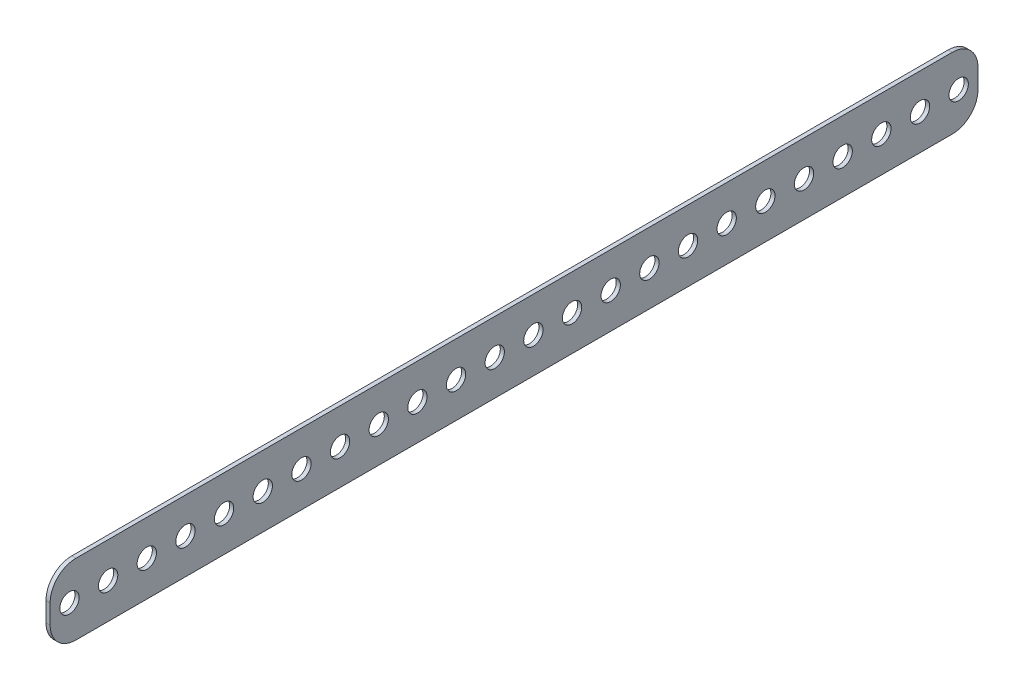
ISO-10303-21;
HEADER;
FILE_DESCRIPTION(('STEP AP214'),'2;1');
FILE_NAME('part.step','',(''),(''),'','','');
FILE_SCHEMA(('AUTOMOTIVE_DESIGN { 1 0 10303 214 1 1 1 1 }'));
ENDSEC;
DATA;
#1=APPLICATION_CONTEXT('core data for automotive mechanical design processes');
#2=APPLICATION_PROTOCOL_DEFINITION('international standard','automotive_design',2000,#1);
#3=PRODUCT_CONTEXT('',#1,'mechanical');
#4=PRODUCT('Part','Part','',(#3));
#5=PRODUCT_RELATED_PRODUCT_CATEGORY('part','',(#4));
#6=PRODUCT_DEFINITION_FORMATION('','',#4);
#7=PRODUCT_DEFINITION_CONTEXT('part definition',#1,'design');
#8=PRODUCT_DEFINITION('design','',#6,#7);
#9=PRODUCT_DEFINITION_SHAPE('','',#8);
#10=(LENGTH_UNIT() NAMED_UNIT(*) SI_UNIT(.MILLI.,.METRE.));
#11=(NAMED_UNIT(*) PLANE_ANGLE_UNIT() SI_UNIT($,.RADIAN.));
#12=(NAMED_UNIT(*) SI_UNIT($,.STERADIAN.) SOLID_ANGLE_UNIT());
#13=UNCERTAINTY_MEASURE_WITH_UNIT(LENGTH_MEASURE(1.E-05),#10,'distance_accuracy_value','');
#14=(GEOMETRIC_REPRESENTATION_CONTEXT(3) GLOBAL_UNCERTAINTY_ASSIGNED_CONTEXT((#13)) GLOBAL_UNIT_ASSIGNED_CONTEXT((#10,
#11,#12)) REPRESENTATION_CONTEXT('',''));
#15=CARTESIAN_POINT('',(0.,0.,0.));
#16=DIRECTION('',(0.,0.,1.));
#17=DIRECTION('',(1.,0.,0.));
#18=AXIS2_PLACEMENT_3D('',#15,#16,#17);
#19=CARTESIAN_POINT('',(0.,0.,228.6));
#20=DIRECTION('',(1.,0.,0.));
#21=DIRECTION('',(0.,0.,-1.));
#22=AXIS2_PLACEMENT_3D('',#19,#20,#21);
#23=PLANE('',#22);
#24=CARTESIAN_POINT('',(0.,17.4625,200.025));
#25=DIRECTION('',(-1.,0.,0.));
#26=DIRECTION('',(0.,0.,1.));
#27=AXIS2_PLACEMENT_3D('',#24,#25,#26);
#28=CIRCLE('',#27,4.76250000000001);
#29=CARTESIAN_POINT('',(0.,17.4625,204.7875));
#30=VERTEX_POINT('',#29);
#31=EDGE_CURVE('E513',#30,#30,#28,.T.);
#32=ORIENTED_EDGE('',*,*,#31,.F.);
#33=EDGE_LOOP('',(#32));
#34=FACE_BOUND('',#33,.T.);
#35=CARTESIAN_POINT('',(0.,17.4625,219.075));
#36=DIRECTION('',(-1.,0.,0.));
#37=DIRECTION('',(0.,0.,1.));
#38=AXIS2_PLACEMENT_3D('',#35,#36,#37);
#39=CIRCLE('',#38,4.76250000000001);
#40=CARTESIAN_POINT('',(0.,17.4625,223.8375));
#41=VERTEX_POINT('',#40);
#42=EDGE_CURVE('E516',#41,#41,#39,.T.);
#43=ORIENTED_EDGE('',*,*,#42,.F.);
#44=EDGE_LOOP('',(#43));
#45=FACE_BOUND('',#44,.T.);
#46=DIRECTION('',(0.,0.,-1.));
#47=VECTOR('',#46,1.);
#48=CARTESIAN_POINT('',(0.,34.925,228.6));
#49=LINE('',#48,#47);
#50=CARTESIAN_POINT('',(0.,34.925,215.9));
#51=VERTEX_POINT('',#50);
#52=CARTESIAN_POINT('',(0.,34.925,-215.9));
#53=VERTEX_POINT('',#52);
#54=EDGE_CURVE('E103',#51,#53,#49,.T.);
#55=ORIENTED_EDGE('',*,*,#54,.T.);
#56=CARTESIAN_POINT('',(0.,22.225,-215.9));
#57=DIRECTION('',(1.,0.,0.));
#58=DIRECTION('',(0.,0.,-1.));
#59=AXIS2_PLACEMENT_3D('',#56,#57,#58);
#60=CIRCLE('',#59,12.7);
#61=CARTESIAN_POINT('',(0.,22.225,-228.6));
#62=VERTEX_POINT('',#61);
#63=EDGE_CURVE('E136',#53,#62,#60,.F.);
#64=ORIENTED_EDGE('',*,*,#63,.T.);
#65=DIRECTION('',(0.,-1.,0.));
#66=VECTOR('',#65,1.);
#67=CARTESIAN_POINT('',(0.,0.,-228.6));
#68=LINE('',#67,#66);
#69=CARTESIAN_POINT('',(0.,12.7,-228.6));
#70=VERTEX_POINT('',#69);
#71=EDGE_CURVE('E159',#62,#70,#68,.T.);
#72=ORIENTED_EDGE('',*,*,#71,.T.);
#73=CARTESIAN_POINT('',(0.,12.7,-215.9));
#74=DIRECTION('',(1.,0.,0.));
#75=DIRECTION('',(0.,0.,-1.));
#76=AXIS2_PLACEMENT_3D('',#73,#74,#75);
#77=CIRCLE('',#76,12.7);
#78=CARTESIAN_POINT('',(0.,0.,-215.9));
#79=VERTEX_POINT('',#78);
#80=EDGE_CURVE('E134',#70,#79,#77,.F.);
#81=ORIENTED_EDGE('',*,*,#80,.T.);
#82=DIRECTION('',(0.,0.,-1.));
#83=VECTOR('',#82,1.);
#84=CARTESIAN_POINT('',(0.,0.,228.6));
#85=LINE('',#84,#83);
#86=CARTESIAN_POINT('',(0.,0.,215.9));
#87=VERTEX_POINT('',#86);
#88=EDGE_CURVE('E168',#87,#79,#85,.T.);
#89=ORIENTED_EDGE('',*,*,#88,.F.);
#90=CARTESIAN_POINT('',(0.,12.7,215.9));
#91=DIRECTION('',(1.,0.,0.));
#92=DIRECTION('',(0.,0.,-1.));
#93=AXIS2_PLACEMENT_3D('',#90,#91,#92);
#94=CIRCLE('',#93,12.7);
#95=CARTESIAN_POINT('',(0.,12.7,228.6));
#96=VERTEX_POINT('',#95);
#97=EDGE_CURVE('E110',#87,#96,#94,.F.);
#98=ORIENTED_EDGE('',*,*,#97,.T.);
#99=DIRECTION('',(0.,-1.,0.));
#100=VECTOR('',#99,1.);
#101=CARTESIAN_POINT('',(0.,0.,228.6));
#102=LINE('',#101,#100);
#103=CARTESIAN_POINT('',(0.,22.225,228.6));
#104=VERTEX_POINT('',#103);
#105=EDGE_CURVE('E105',#104,#96,#102,.T.);
#106=ORIENTED_EDGE('',*,*,#105,.F.);
#107=CARTESIAN_POINT('',(0.,22.225,215.9));
#108=DIRECTION('',(1.,0.,0.));
#109=DIRECTION('',(0.,0.,-1.));
#110=AXIS2_PLACEMENT_3D('',#107,#108,#109);
#111=CIRCLE('',#110,12.7);
#112=EDGE_CURVE('E100',#104,#51,#111,.F.);
#113=ORIENTED_EDGE('',*,*,#112,.T.);
#114=EDGE_LOOP('',(#55,#64,#72,#81,#89,#98,#106,#113));
#115=FACE_BOUND('',#114,.T.);
#116=CARTESIAN_POINT('',(0.,17.4625,180.975));
#117=DIRECTION('',(-1.,0.,0.));
#118=DIRECTION('',(0.,0.,1.));
#119=AXIS2_PLACEMENT_3D('',#116,#117,#118);
#120=CIRCLE('',#119,4.76250000000001);
#121=CARTESIAN_POINT('',(0.,17.4625,185.7375));
#122=VERTEX_POINT('',#121);
#123=EDGE_CURVE('E171',#122,#122,#120,.T.);
#124=ORIENTED_EDGE('',*,*,#123,.F.);
#125=EDGE_LOOP('',(#124));
#126=FACE_BOUND('',#125,.T.);
#127=CARTESIAN_POINT('',(0.,17.4625,161.925));
#128=DIRECTION('',(-1.,0.,0.));
#129=DIRECTION('',(0.,0.,1.));
#130=AXIS2_PLACEMENT_3D('',#127,#128,#129);
#131=CIRCLE('',#130,4.76250000000001);
#132=CARTESIAN_POINT('',(0.,17.4625,166.6875));
#133=VERTEX_POINT('',#132);
#134=EDGE_CURVE('E177',#133,#133,#131,.T.);
#135=ORIENTED_EDGE('',*,*,#134,.F.);
#136=EDGE_LOOP('',(#135));
#137=FACE_BOUND('',#136,.T.);
#138=CARTESIAN_POINT('',(0.,17.4625,142.875));
#139=DIRECTION('',(-1.,0.,0.));
#140=DIRECTION('',(0.,0.,1.));
#141=AXIS2_PLACEMENT_3D('',#138,#139,#140);
#142=CIRCLE('',#141,4.76250000000001);
#143=CARTESIAN_POINT('',(0.,17.4625,147.6375));
#144=VERTEX_POINT('',#143);
#145=EDGE_CURVE('E183',#144,#144,#142,.T.);
#146=ORIENTED_EDGE('',*,*,#145,.F.);
#147=EDGE_LOOP('',(#146));
#148=FACE_BOUND('',#147,.T.);
#149=CARTESIAN_POINT('',(0.,17.4625,123.825));
#150=DIRECTION('',(-1.,0.,0.));
#151=DIRECTION('',(0.,0.,1.));
#152=AXIS2_PLACEMENT_3D('',#149,#150,#151);
#153=CIRCLE('',#152,4.76250000000001);
#154=CARTESIAN_POINT('',(0.,17.4625,128.5875));
#155=VERTEX_POINT('',#154);
#156=EDGE_CURVE('E189',#155,#155,#153,.T.);
#157=ORIENTED_EDGE('',*,*,#156,.F.);
#158=EDGE_LOOP('',(#157));
#159=FACE_BOUND('',#158,.T.);
#160=CARTESIAN_POINT('',(0.,17.4625,104.775));
#161=DIRECTION('',(-1.,0.,0.));
#162=DIRECTION('',(0.,0.,1.));
#163=AXIS2_PLACEMENT_3D('',#160,#161,#162);
#164=CIRCLE('',#163,4.76250000000001);
#165=CARTESIAN_POINT('',(0.,17.4625,109.5375));
#166=VERTEX_POINT('',#165);
#167=EDGE_CURVE('E195',#166,#166,#164,.T.);
#168=ORIENTED_EDGE('',*,*,#167,.F.);
#169=EDGE_LOOP('',(#168));
#170=FACE_BOUND('',#169,.T.);
#171=CARTESIAN_POINT('',(0.,17.4625,85.725));
#172=DIRECTION('',(-1.,0.,0.));
#173=DIRECTION('',(0.,0.,1.));
#174=AXIS2_PLACEMENT_3D('',#171,#172,#173);
#175=CIRCLE('',#174,4.76250000000001);
#176=CARTESIAN_POINT('',(0.,17.4625,90.4875));
#177=VERTEX_POINT('',#176);
#178=EDGE_CURVE('E201',#177,#177,#175,.T.);
#179=ORIENTED_EDGE('',*,*,#178,.F.);
#180=EDGE_LOOP('',(#179));
#181=FACE_BOUND('',#180,.T.);
#182=CARTESIAN_POINT('',(0.,17.4625,66.675));
#183=DIRECTION('',(-1.,0.,0.));
#184=DIRECTION('',(0.,0.,1.));
#185=AXIS2_PLACEMENT_3D('',#182,#183,#184);
#186=CIRCLE('',#185,4.76250000000001);
#187=CARTESIAN_POINT('',(0.,17.4625,71.4375));
#188=VERTEX_POINT('',#187);
#189=EDGE_CURVE('E207',#188,#188,#186,.T.);
#190=ORIENTED_EDGE('',*,*,#189,.F.);
#191=EDGE_LOOP('',(#190));
#192=FACE_BOUND('',#191,.T.);
#193=CARTESIAN_POINT('',(0.,17.4625,47.625));
#194=DIRECTION('',(-1.,0.,0.));
#195=DIRECTION('',(0.,0.,1.));
#196=AXIS2_PLACEMENT_3D('',#193,#194,#195);
#197=CIRCLE('',#196,4.76250000000001);
#198=CARTESIAN_POINT('',(0.,17.4625,52.3875));
#199=VERTEX_POINT('',#198);
#200=EDGE_CURVE('E213',#199,#199,#197,.T.);
#201=ORIENTED_EDGE('',*,*,#200,.F.);
#202=EDGE_LOOP('',(#201));
#203=FACE_BOUND('',#202,.T.);
#204=CARTESIAN_POINT('',(0.,17.4625,28.575));
#205=DIRECTION('',(-1.,0.,0.));
#206=DIRECTION('',(0.,0.,1.));
#207=AXIS2_PLACEMENT_3D('',#204,#205,#206);
#208=CIRCLE('',#207,4.76250000000001);
#209=CARTESIAN_POINT('',(0.,17.4625,33.3375));
#210=VERTEX_POINT('',#209);
#211=EDGE_CURVE('E219',#210,#210,#208,.T.);
#212=ORIENTED_EDGE('',*,*,#211,.F.);
#213=EDGE_LOOP('',(#212));
#214=FACE_BOUND('',#213,.T.);
#215=CARTESIAN_POINT('',(0.,17.4625,9.52499999999998));
#216=DIRECTION('',(-1.,0.,0.));
#217=DIRECTION('',(0.,0.,1.));
#218=AXIS2_PLACEMENT_3D('',#215,#216,#217);
#219=CIRCLE('',#218,4.76250000000001);
#220=CARTESIAN_POINT('',(0.,17.4625,14.2875));
#221=VERTEX_POINT('',#220);
#222=EDGE_CURVE('E225',#221,#221,#219,.T.);
#223=ORIENTED_EDGE('',*,*,#222,.F.);
#224=EDGE_LOOP('',(#223));
#225=FACE_BOUND('',#224,.T.);
#226=CARTESIAN_POINT('',(0.,17.4625,-9.52500000000003));
#227=DIRECTION('',(-1.,0.,0.));
#228=DIRECTION('',(0.,0.,1.));
#229=AXIS2_PLACEMENT_3D('',#226,#227,#228);
#230=CIRCLE('',#229,4.76250000000001);
#231=CARTESIAN_POINT('',(0.,17.4625,-4.76250000000002));
#232=VERTEX_POINT('',#231);
#233=EDGE_CURVE('E231',#232,#232,#230,.T.);
#234=ORIENTED_EDGE('',*,*,#233,.F.);
#235=EDGE_LOOP('',(#234));
#236=FACE_BOUND('',#235,.T.);
#237=CARTESIAN_POINT('',(0.,17.4625,-28.575));
#238=DIRECTION('',(-1.,0.,0.));
#239=DIRECTION('',(0.,0.,1.));
#240=AXIS2_PLACEMENT_3D('',#237,#238,#239);
#241=CIRCLE('',#240,4.76250000000001);
#242=CARTESIAN_POINT('',(0.,17.4625,-23.8125));
#243=VERTEX_POINT('',#242);
#244=EDGE_CURVE('E237',#243,#243,#241,.T.);
#245=ORIENTED_EDGE('',*,*,#244,.F.);
#246=EDGE_LOOP('',(#245));
#247=FACE_BOUND('',#246,.T.);
#248=CARTESIAN_POINT('',(0.,17.4625,-47.625));
#249=DIRECTION('',(-1.,0.,0.));
#250=DIRECTION('',(0.,0.,1.));
#251=AXIS2_PLACEMENT_3D('',#248,#249,#250);
#252=CIRCLE('',#251,4.76250000000001);
#253=CARTESIAN_POINT('',(0.,17.4625,-42.8625));
#254=VERTEX_POINT('',#253);
#255=EDGE_CURVE('E243',#254,#254,#252,.T.);
#256=ORIENTED_EDGE('',*,*,#255,.F.);
#257=EDGE_LOOP('',(#256));
#258=FACE_BOUND('',#257,.T.);
#259=CARTESIAN_POINT('',(0.,17.4625,-66.675));
#260=DIRECTION('',(-1.,0.,0.));
#261=DIRECTION('',(0.,0.,1.));
#262=AXIS2_PLACEMENT_3D('',#259,#260,#261);
#263=CIRCLE('',#262,4.76250000000001);
#264=CARTESIAN_POINT('',(0.,17.4625,-61.9125));
#265=VERTEX_POINT('',#264);
#266=EDGE_CURVE('E249',#265,#265,#263,.T.);
#267=ORIENTED_EDGE('',*,*,#266,.F.);
#268=EDGE_LOOP('',(#267));
#269=FACE_BOUND('',#268,.T.);
#270=CARTESIAN_POINT('',(0.,17.4625,-85.725));
#271=DIRECTION('',(-1.,0.,0.));
#272=DIRECTION('',(0.,0.,1.));
#273=AXIS2_PLACEMENT_3D('',#270,#271,#272);
#274=CIRCLE('',#273,4.76250000000001);
#275=CARTESIAN_POINT('',(0.,17.4625,-80.9625));
#276=VERTEX_POINT('',#275);
#277=EDGE_CURVE('E255',#276,#276,#274,.T.);
#278=ORIENTED_EDGE('',*,*,#277,.F.);
#279=EDGE_LOOP('',(#278));
#280=FACE_BOUND('',#279,.T.);
#281=CARTESIAN_POINT('',(0.,17.4625,-104.775));
#282=DIRECTION('',(-1.,0.,0.));
#283=DIRECTION('',(0.,0.,1.));
#284=AXIS2_PLACEMENT_3D('',#281,#282,#283);
#285=CIRCLE('',#284,4.76250000000001);
#286=CARTESIAN_POINT('',(0.,17.4625,-100.0125));
#287=VERTEX_POINT('',#286);
#288=EDGE_CURVE('E261',#287,#287,#285,.T.);
#289=ORIENTED_EDGE('',*,*,#288,.F.);
#290=EDGE_LOOP('',(#289));
#291=FACE_BOUND('',#290,.T.);
#292=CARTESIAN_POINT('',(0.,17.4625,-123.825));
#293=DIRECTION('',(-1.,0.,0.));
#294=DIRECTION('',(0.,0.,1.));
#295=AXIS2_PLACEMENT_3D('',#292,#293,#294);
#296=CIRCLE('',#295,4.76250000000001);
#297=CARTESIAN_POINT('',(0.,17.4625,-119.0625));
#298=VERTEX_POINT('',#297);
#299=EDGE_CURVE('E267',#298,#298,#296,.T.);
#300=ORIENTED_EDGE('',*,*,#299,.F.);
#301=EDGE_LOOP('',(#300));
#302=FACE_BOUND('',#301,.T.);
#303=CARTESIAN_POINT('',(0.,17.4625,-142.875));
#304=DIRECTION('',(-1.,0.,0.));
#305=DIRECTION('',(0.,0.,1.));
#306=AXIS2_PLACEMENT_3D('',#303,#304,#305);
#307=CIRCLE('',#306,4.76250000000001);
#308=CARTESIAN_POINT('',(0.,17.4625,-138.1125));
#309=VERTEX_POINT('',#308);
#310=EDGE_CURVE('E273',#309,#309,#307,.T.);
#311=ORIENTED_EDGE('',*,*,#310,.F.);
#312=EDGE_LOOP('',(#311));
#313=FACE_BOUND('',#312,.T.);
#314=CARTESIAN_POINT('',(0.,17.4625,-161.925));
#315=DIRECTION('',(-1.,0.,0.));
#316=DIRECTION('',(0.,0.,1.));
#317=AXIS2_PLACEMENT_3D('',#314,#315,#316);
#318=CIRCLE('',#317,4.76250000000001);
#319=CARTESIAN_POINT('',(0.,17.4625,-157.1625));
#320=VERTEX_POINT('',#319);
#321=EDGE_CURVE('E279',#320,#320,#318,.T.);
#322=ORIENTED_EDGE('',*,*,#321,.F.);
#323=EDGE_LOOP('',(#322));
#324=FACE_BOUND('',#323,.T.);
#325=CARTESIAN_POINT('',(0.,17.4625,-180.975));
#326=DIRECTION('',(-1.,0.,0.));
#327=DIRECTION('',(0.,0.,1.));
#328=AXIS2_PLACEMENT_3D('',#325,#326,#327);
#329=CIRCLE('',#328,4.76250000000001);
#330=CARTESIAN_POINT('',(0.,17.4625,-176.2125));
#331=VERTEX_POINT('',#330);
#332=EDGE_CURVE('E285',#331,#331,#329,.T.);
#333=ORIENTED_EDGE('',*,*,#332,.F.);
#334=EDGE_LOOP('',(#333));
#335=FACE_BOUND('',#334,.T.);
#336=CARTESIAN_POINT('',(0.,17.4625,-200.025));
#337=DIRECTION('',(-1.,0.,0.));
#338=DIRECTION('',(0.,0.,1.));
#339=AXIS2_PLACEMENT_3D('',#336,#337,#338);
#340=CIRCLE('',#339,4.76250000000001);
#341=CARTESIAN_POINT('',(0.,17.4625,-195.2625));
#342=VERTEX_POINT('',#341);
#343=EDGE_CURVE('E291',#342,#342,#340,.T.);
#344=ORIENTED_EDGE('',*,*,#343,.F.);
#345=EDGE_LOOP('',(#344));
#346=FACE_BOUND('',#345,.T.);
#347=CARTESIAN_POINT('',(0.,17.4625,-219.075));
#348=DIRECTION('',(-1.,0.,0.));
#349=DIRECTION('',(0.,0.,1.));
#350=AXIS2_PLACEMENT_3D('',#347,#348,#349);
#351=CIRCLE('',#350,4.76250000000001);
#352=CARTESIAN_POINT('',(0.,17.4625,-214.3125));
#353=VERTEX_POINT('',#352);
#354=EDGE_CURVE('E129',#353,#353,#351,.T.);
#355=ORIENTED_EDGE('',*,*,#354,.F.);
#356=EDGE_LOOP('',(#355));
#357=FACE_BOUND('',#356,.T.);
#358=ADVANCED_FACE('F33',(#34,#45,#115,#126,#137,#148,#159,#170,#181,#192,#203,#214,#225,#236,
#247,#258,#269,#280,#291,#302,#313,#324,#335,#346,#357),#23,.F.);
#359=CARTESIAN_POINT('',(2.032,0.,228.6));
#360=DIRECTION('',(0.,1.,0.));
#361=DIRECTION('',(-1.,0.,0.));
#362=AXIS2_PLACEMENT_3D('',#359,#360,#361);
#363=PLANE('',#362);
#364=ORIENTED_EDGE('',*,*,#88,.T.);
#365=DIRECTION('',(1.,0.,0.));
#366=VECTOR('',#365,1.);
#367=CARTESIAN_POINT('',(2.032,0.,-215.9));
#368=LINE('',#367,#366);
#369=CARTESIAN_POINT('',(2.032,0.,-215.9));
#370=VERTEX_POINT('',#369);
#371=EDGE_CURVE('E149',#79,#370,#368,.T.);
#372=ORIENTED_EDGE('',*,*,#371,.T.);
#373=DIRECTION('',(0.,0.,-1.));
#374=VECTOR('',#373,1.);
#375=CARTESIAN_POINT('',(2.032,0.,228.6));
#376=LINE('',#375,#374);
#377=CARTESIAN_POINT('',(2.032,0.,215.9));
#378=VERTEX_POINT('',#377);
#379=EDGE_CURVE('E166',#378,#370,#376,.T.);
#380=ORIENTED_EDGE('',*,*,#379,.F.);
#381=DIRECTION('',(1.,0.,0.));
#382=VECTOR('',#381,1.);
#383=CARTESIAN_POINT('',(0.,0.,215.9));
#384=LINE('',#383,#382);
#385=EDGE_CURVE('E147',#378,#87,#384,.F.);
#386=ORIENTED_EDGE('',*,*,#385,.T.);
#387=EDGE_LOOP('',(#364,#372,#380,#386));
#388=FACE_BOUND('',#387,.T.);
#389=ADVANCED_FACE('F303',(#388),#363,.F.);
#390=CARTESIAN_POINT('',(2.032,0.,228.6));
#391=DIRECTION('',(-1.,0.,0.));
#392=DIRECTION('',(0.,0.,1.));
#393=AXIS2_PLACEMENT_3D('',#390,#391,#392);
#394=PLANE('',#393);
#395=CARTESIAN_POINT('',(2.032,17.4625,200.025));
#396=DIRECTION('',(-1.,0.,0.));
#397=DIRECTION('',(0.,0.,1.));
#398=AXIS2_PLACEMENT_3D('',#395,#396,#397);
#399=CIRCLE('',#398,4.76250000000001);
#400=CARTESIAN_POINT('',(2.032,17.4625,204.7875));
#401=VERTEX_POINT('',#400);
#402=EDGE_CURVE('E515',#401,#401,#399,.F.);
#403=ORIENTED_EDGE('',*,*,#402,.F.);
#404=EDGE_LOOP('',(#403));
#405=FACE_BOUND('',#404,.T.);
#406=CARTESIAN_POINT('',(2.032,17.4625,219.075));
#407=DIRECTION('',(-1.,0.,0.));
#408=DIRECTION('',(0.,0.,1.));
#409=AXIS2_PLACEMENT_3D('',#406,#407,#408);
#410=CIRCLE('',#409,4.76250000000001);
#411=CARTESIAN_POINT('',(2.032,17.4625,223.8375));
#412=VERTEX_POINT('',#411);
#413=EDGE_CURVE('E162',#412,#412,#410,.F.);
#414=ORIENTED_EDGE('',*,*,#413,.F.);
#415=EDGE_LOOP('',(#414));
#416=FACE_BOUND('',#415,.T.);
#417=DIRECTION('',(0.,1.,0.));
#418=VECTOR('',#417,1.);
#419=CARTESIAN_POINT('',(2.032,0.,-228.6));
#420=LINE('',#419,#418);
#421=CARTESIAN_POINT('',(2.032,12.7,-228.6));
#422=VERTEX_POINT('',#421);
#423=CARTESIAN_POINT('',(2.032,22.225,-228.6));
#424=VERTEX_POINT('',#423);
#425=EDGE_CURVE('E155',#422,#424,#420,.T.);
#426=ORIENTED_EDGE('',*,*,#425,.T.);
#427=CARTESIAN_POINT('',(2.032,22.225,-215.9));
#428=DIRECTION('',(-1.,0.,0.));
#429=DIRECTION('',(0.,0.,1.));
#430=AXIS2_PLACEMENT_3D('',#427,#428,#429);
#431=CIRCLE('',#430,12.7);
#432=CARTESIAN_POINT('',(2.032,34.925,-215.9));
#433=VERTEX_POINT('',#432);
#434=EDGE_CURVE('E145',#424,#433,#431,.F.);
#435=ORIENTED_EDGE('',*,*,#434,.T.);
#436=DIRECTION('',(0.,0.,-1.));
#437=VECTOR('',#436,1.);
#438=CARTESIAN_POINT('',(2.032,34.925,228.6));
#439=LINE('',#438,#437);
#440=CARTESIAN_POINT('',(2.032,34.925,215.9));
#441=VERTEX_POINT('',#440);
#442=EDGE_CURVE('E120',#441,#433,#439,.T.);
#443=ORIENTED_EDGE('',*,*,#442,.F.);
#444=CARTESIAN_POINT('',(2.032,22.225,215.9));
#445=DIRECTION('',(-1.,0.,0.));
#446=DIRECTION('',(0.,0.,1.));
#447=AXIS2_PLACEMENT_3D('',#444,#445,#446);
#448=CIRCLE('',#447,12.7);
#449=CARTESIAN_POINT('',(2.032,22.225,228.6));
#450=VERTEX_POINT('',#449);
#451=EDGE_CURVE('E124',#441,#450,#448,.F.);
#452=ORIENTED_EDGE('',*,*,#451,.T.);
#453=DIRECTION('',(0.,1.,0.));
#454=VECTOR('',#453,1.);
#455=CARTESIAN_POINT('',(2.032,0.,228.6));
#456=LINE('',#455,#454);
#457=CARTESIAN_POINT('',(2.032,12.7,228.6));
#458=VERTEX_POINT('',#457);
#459=EDGE_CURVE('E121',#458,#450,#456,.T.);
#460=ORIENTED_EDGE('',*,*,#459,.F.);
#461=CARTESIAN_POINT('',(2.032,12.7,215.9));
#462=DIRECTION('',(-1.,0.,0.));
#463=DIRECTION('',(0.,0.,1.));
#464=AXIS2_PLACEMENT_3D('',#461,#462,#463);
#465=CIRCLE('',#464,12.7);
#466=EDGE_CURVE('E56',#458,#378,#465,.F.);
#467=ORIENTED_EDGE('',*,*,#466,.T.);
#468=ORIENTED_EDGE('',*,*,#379,.T.);
#469=CARTESIAN_POINT('',(2.032,12.7,-215.9));
#470=DIRECTION('',(-1.,0.,0.));
#471=DIRECTION('',(0.,0.,1.));
#472=AXIS2_PLACEMENT_3D('',#469,#470,#471);
#473=CIRCLE('',#472,12.7);
#474=EDGE_CURVE('E48',#370,#422,#473,.F.);
#475=ORIENTED_EDGE('',*,*,#474,.T.);
#476=EDGE_LOOP('',(#426,#435,#443,#452,#460,#467,#468,#475));
#477=FACE_BOUND('',#476,.T.);
#478=CARTESIAN_POINT('',(2.032,17.4625,180.975));
#479=DIRECTION('',(-1.,0.,0.));
#480=DIRECTION('',(0.,0.,1.));
#481=AXIS2_PLACEMENT_3D('',#478,#479,#480);
#482=CIRCLE('',#481,4.76250000000001);
#483=CARTESIAN_POINT('',(2.032,17.4625,185.7375));
#484=VERTEX_POINT('',#483);
#485=EDGE_CURVE('E174',#484,#484,#482,.F.);
#486=ORIENTED_EDGE('',*,*,#485,.F.);
#487=EDGE_LOOP('',(#486));
#488=FACE_BOUND('',#487,.T.);
#489=CARTESIAN_POINT('',(2.032,17.4625,161.925));
#490=DIRECTION('',(-1.,0.,0.));
#491=DIRECTION('',(0.,0.,1.));
#492=AXIS2_PLACEMENT_3D('',#489,#490,#491);
#493=CIRCLE('',#492,4.76250000000001);
#494=CARTESIAN_POINT('',(2.032,17.4625,166.6875));
#495=VERTEX_POINT('',#494);
#496=EDGE_CURVE('E180',#495,#495,#493,.F.);
#497=ORIENTED_EDGE('',*,*,#496,.F.);
#498=EDGE_LOOP('',(#497));
#499=FACE_BOUND('',#498,.T.);
#500=CARTESIAN_POINT('',(2.032,17.4625,142.875));
#501=DIRECTION('',(-1.,0.,0.));
#502=DIRECTION('',(0.,0.,1.));
#503=AXIS2_PLACEMENT_3D('',#500,#501,#502);
#504=CIRCLE('',#503,4.76250000000001);
#505=CARTESIAN_POINT('',(2.032,17.4625,147.6375));
#506=VERTEX_POINT('',#505);
#507=EDGE_CURVE('E186',#506,#506,#504,.F.);
#508=ORIENTED_EDGE('',*,*,#507,.F.);
#509=EDGE_LOOP('',(#508));
#510=FACE_BOUND('',#509,.T.);
#511=CARTESIAN_POINT('',(2.032,17.4625,123.825));
#512=DIRECTION('',(-1.,0.,0.));
#513=DIRECTION('',(0.,0.,1.));
#514=AXIS2_PLACEMENT_3D('',#511,#512,#513);
#515=CIRCLE('',#514,4.76250000000001);
#516=CARTESIAN_POINT('',(2.032,17.4625,128.5875));
#517=VERTEX_POINT('',#516);
#518=EDGE_CURVE('E192',#517,#517,#515,.F.);
#519=ORIENTED_EDGE('',*,*,#518,.F.);
#520=EDGE_LOOP('',(#519));
#521=FACE_BOUND('',#520,.T.);
#522=CARTESIAN_POINT('',(2.032,17.4625,104.775));
#523=DIRECTION('',(-1.,0.,0.));
#524=DIRECTION('',(0.,0.,1.));
#525=AXIS2_PLACEMENT_3D('',#522,#523,#524);
#526=CIRCLE('',#525,4.76250000000001);
#527=CARTESIAN_POINT('',(2.032,17.4625,109.5375));
#528=VERTEX_POINT('',#527);
#529=EDGE_CURVE('E198',#528,#528,#526,.F.);
#530=ORIENTED_EDGE('',*,*,#529,.F.);
#531=EDGE_LOOP('',(#530));
#532=FACE_BOUND('',#531,.T.);
#533=CARTESIAN_POINT('',(2.032,17.4625,85.725));
#534=DIRECTION('',(-1.,0.,0.));
#535=DIRECTION('',(0.,0.,1.));
#536=AXIS2_PLACEMENT_3D('',#533,#534,#535);
#537=CIRCLE('',#536,4.76250000000001);
#538=CARTESIAN_POINT('',(2.032,17.4625,90.4875));
#539=VERTEX_POINT('',#538);
#540=EDGE_CURVE('E204',#539,#539,#537,.F.);
#541=ORIENTED_EDGE('',*,*,#540,.F.);
#542=EDGE_LOOP('',(#541));
#543=FACE_BOUND('',#542,.T.);
#544=CARTESIAN_POINT('',(2.032,17.4625,66.675));
#545=DIRECTION('',(-1.,0.,0.));
#546=DIRECTION('',(0.,0.,1.));
#547=AXIS2_PLACEMENT_3D('',#544,#545,#546);
#548=CIRCLE('',#547,4.76250000000001);
#549=CARTESIAN_POINT('',(2.032,17.4625,71.4375));
#550=VERTEX_POINT('',#549);
#551=EDGE_CURVE('E210',#550,#550,#548,.F.);
#552=ORIENTED_EDGE('',*,*,#551,.F.);
#553=EDGE_LOOP('',(#552));
#554=FACE_BOUND('',#553,.T.);
#555=CARTESIAN_POINT('',(2.032,17.4625,47.625));
#556=DIRECTION('',(-1.,0.,0.));
#557=DIRECTION('',(0.,0.,1.));
#558=AXIS2_PLACEMENT_3D('',#555,#556,#557);
#559=CIRCLE('',#558,4.76250000000001);
#560=CARTESIAN_POINT('',(2.032,17.4625,52.3875));
#561=VERTEX_POINT('',#560);
#562=EDGE_CURVE('E216',#561,#561,#559,.F.);
#563=ORIENTED_EDGE('',*,*,#562,.F.);
#564=EDGE_LOOP('',(#563));
#565=FACE_BOUND('',#564,.T.);
#566=CARTESIAN_POINT('',(2.032,17.4625,28.575));
#567=DIRECTION('',(-1.,0.,0.));
#568=DIRECTION('',(0.,0.,1.));
#569=AXIS2_PLACEMENT_3D('',#566,#567,#568);
#570=CIRCLE('',#569,4.76250000000001);
#571=CARTESIAN_POINT('',(2.032,17.4625,33.3375));
#572=VERTEX_POINT('',#571);
#573=EDGE_CURVE('E222',#572,#572,#570,.F.);
#574=ORIENTED_EDGE('',*,*,#573,.F.);
#575=EDGE_LOOP('',(#574));
#576=FACE_BOUND('',#575,.T.);
#577=CARTESIAN_POINT('',(2.032,17.4625,9.52499999999998));
#578=DIRECTION('',(-1.,0.,0.));
#579=DIRECTION('',(0.,0.,1.));
#580=AXIS2_PLACEMENT_3D('',#577,#578,#579);
#581=CIRCLE('',#580,4.76250000000001);
#582=CARTESIAN_POINT('',(2.032,17.4625,14.2875));
#583=VERTEX_POINT('',#582);
#584=EDGE_CURVE('E228',#583,#583,#581,.F.);
#585=ORIENTED_EDGE('',*,*,#584,.F.);
#586=EDGE_LOOP('',(#585));
#587=FACE_BOUND('',#586,.T.);
#588=CARTESIAN_POINT('',(2.032,17.4625,-9.52500000000003));
#589=DIRECTION('',(-1.,0.,0.));
#590=DIRECTION('',(0.,0.,1.));
#591=AXIS2_PLACEMENT_3D('',#588,#589,#590);
#592=CIRCLE('',#591,4.76250000000001);
#593=CARTESIAN_POINT('',(2.032,17.4625,-4.76250000000002));
#594=VERTEX_POINT('',#593);
#595=EDGE_CURVE('E234',#594,#594,#592,.F.);
#596=ORIENTED_EDGE('',*,*,#595,.F.);
#597=EDGE_LOOP('',(#596));
#598=FACE_BOUND('',#597,.T.);
#599=CARTESIAN_POINT('',(2.032,17.4625,-28.575));
#600=DIRECTION('',(-1.,0.,0.));
#601=DIRECTION('',(0.,0.,1.));
#602=AXIS2_PLACEMENT_3D('',#599,#600,#601);
#603=CIRCLE('',#602,4.76250000000001);
#604=CARTESIAN_POINT('',(2.032,17.4625,-23.8125));
#605=VERTEX_POINT('',#604);
#606=EDGE_CURVE('E240',#605,#605,#603,.F.);
#607=ORIENTED_EDGE('',*,*,#606,.F.);
#608=EDGE_LOOP('',(#607));
#609=FACE_BOUND('',#608,.T.);
#610=CARTESIAN_POINT('',(2.032,17.4625,-47.625));
#611=DIRECTION('',(-1.,0.,0.));
#612=DIRECTION('',(0.,0.,1.));
#613=AXIS2_PLACEMENT_3D('',#610,#611,#612);
#614=CIRCLE('',#613,4.76250000000001);
#615=CARTESIAN_POINT('',(2.032,17.4625,-42.8625));
#616=VERTEX_POINT('',#615);
#617=EDGE_CURVE('E246',#616,#616,#614,.F.);
#618=ORIENTED_EDGE('',*,*,#617,.F.);
#619=EDGE_LOOP('',(#618));
#620=FACE_BOUND('',#619,.T.);
#621=CARTESIAN_POINT('',(2.032,17.4625,-66.675));
#622=DIRECTION('',(-1.,0.,0.));
#623=DIRECTION('',(0.,0.,1.));
#624=AXIS2_PLACEMENT_3D('',#621,#622,#623);
#625=CIRCLE('',#624,4.76250000000001);
#626=CARTESIAN_POINT('',(2.032,17.4625,-61.9125));
#627=VERTEX_POINT('',#626);
#628=EDGE_CURVE('E252',#627,#627,#625,.F.);
#629=ORIENTED_EDGE('',*,*,#628,.F.);
#630=EDGE_LOOP('',(#629));
#631=FACE_BOUND('',#630,.T.);
#632=CARTESIAN_POINT('',(2.032,17.4625,-85.725));
#633=DIRECTION('',(-1.,0.,0.));
#634=DIRECTION('',(0.,0.,1.));
#635=AXIS2_PLACEMENT_3D('',#632,#633,#634);
#636=CIRCLE('',#635,4.76250000000001);
#637=CARTESIAN_POINT('',(2.032,17.4625,-80.9625));
#638=VERTEX_POINT('',#637);
#639=EDGE_CURVE('E258',#638,#638,#636,.F.);
#640=ORIENTED_EDGE('',*,*,#639,.F.);
#641=EDGE_LOOP('',(#640));
#642=FACE_BOUND('',#641,.T.);
#643=CARTESIAN_POINT('',(2.032,17.4625,-104.775));
#644=DIRECTION('',(-1.,0.,0.));
#645=DIRECTION('',(0.,0.,1.));
#646=AXIS2_PLACEMENT_3D('',#643,#644,#645);
#647=CIRCLE('',#646,4.76250000000001);
#648=CARTESIAN_POINT('',(2.032,17.4625,-100.0125));
#649=VERTEX_POINT('',#648);
#650=EDGE_CURVE('E264',#649,#649,#647,.F.);
#651=ORIENTED_EDGE('',*,*,#650,.F.);
#652=EDGE_LOOP('',(#651));
#653=FACE_BOUND('',#652,.T.);
#654=CARTESIAN_POINT('',(2.032,17.4625,-123.825));
#655=DIRECTION('',(-1.,0.,0.));
#656=DIRECTION('',(0.,0.,1.));
#657=AXIS2_PLACEMENT_3D('',#654,#655,#656);
#658=CIRCLE('',#657,4.76250000000001);
#659=CARTESIAN_POINT('',(2.032,17.4625,-119.0625));
#660=VERTEX_POINT('',#659);
#661=EDGE_CURVE('E270',#660,#660,#658,.F.);
#662=ORIENTED_EDGE('',*,*,#661,.F.);
#663=EDGE_LOOP('',(#662));
#664=FACE_BOUND('',#663,.T.);
#665=CARTESIAN_POINT('',(2.032,17.4625,-142.875));
#666=DIRECTION('',(-1.,0.,0.));
#667=DIRECTION('',(0.,0.,1.));
#668=AXIS2_PLACEMENT_3D('',#665,#666,#667);
#669=CIRCLE('',#668,4.76250000000001);
#670=CARTESIAN_POINT('',(2.032,17.4625,-138.1125));
#671=VERTEX_POINT('',#670);
#672=EDGE_CURVE('E276',#671,#671,#669,.F.);
#673=ORIENTED_EDGE('',*,*,#672,.F.);
#674=EDGE_LOOP('',(#673));
#675=FACE_BOUND('',#674,.T.);
#676=CARTESIAN_POINT('',(2.032,17.4625,-161.925));
#677=DIRECTION('',(-1.,0.,0.));
#678=DIRECTION('',(0.,0.,1.));
#679=AXIS2_PLACEMENT_3D('',#676,#677,#678);
#680=CIRCLE('',#679,4.76250000000001);
#681=CARTESIAN_POINT('',(2.032,17.4625,-157.1625));
#682=VERTEX_POINT('',#681);
#683=EDGE_CURVE('E282',#682,#682,#680,.F.);
#684=ORIENTED_EDGE('',*,*,#683,.F.);
#685=EDGE_LOOP('',(#684));
#686=FACE_BOUND('',#685,.T.);
#687=CARTESIAN_POINT('',(2.032,17.4625,-180.975));
#688=DIRECTION('',(-1.,0.,0.));
#689=DIRECTION('',(0.,0.,1.));
#690=AXIS2_PLACEMENT_3D('',#687,#688,#689);
#691=CIRCLE('',#690,4.76250000000001);
#692=CARTESIAN_POINT('',(2.032,17.4625,-176.2125));
#693=VERTEX_POINT('',#692);
#694=EDGE_CURVE('E288',#693,#693,#691,.F.);
#695=ORIENTED_EDGE('',*,*,#694,.F.);
#696=EDGE_LOOP('',(#695));
#697=FACE_BOUND('',#696,.T.);
#698=CARTESIAN_POINT('',(2.032,17.4625,-200.025));
#699=DIRECTION('',(-1.,0.,0.));
#700=DIRECTION('',(0.,0.,1.));
#701=AXIS2_PLACEMENT_3D('',#698,#699,#700);
#702=CIRCLE('',#701,4.76250000000001);
#703=CARTESIAN_POINT('',(2.032,17.4625,-195.2625));
#704=VERTEX_POINT('',#703);
#705=EDGE_CURVE('E294',#704,#704,#702,.F.);
#706=ORIENTED_EDGE('',*,*,#705,.F.);
#707=EDGE_LOOP('',(#706));
#708=FACE_BOUND('',#707,.T.);
#709=CARTESIAN_POINT('',(2.032,17.4625,-219.075));
#710=DIRECTION('',(-1.,0.,0.));
#711=DIRECTION('',(0.,0.,1.));
#712=AXIS2_PLACEMENT_3D('',#709,#710,#711);
#713=CIRCLE('',#712,4.76250000000001);
#714=CARTESIAN_POINT('',(2.032,17.4625,-214.3125));
#715=VERTEX_POINT('',#714);
#716=EDGE_CURVE('E125',#715,#715,#713,.F.);
#717=ORIENTED_EDGE('',*,*,#716,.F.);
#718=EDGE_LOOP('',(#717));
#719=FACE_BOUND('',#718,.T.);
#720=ADVANCED_FACE('F309',(#405,#416,#477,#488,#499,#510,#521,#532,#543,#554,#565,#576,#587,
#598,#609,#620,#631,#642,#653,#664,#675,#686,#697,#708,#719),#394,.F.);
#721=CARTESIAN_POINT('',(2.032,34.925,228.6));
#722=DIRECTION('',(0.,-1.,0.));
#723=DIRECTION('',(0.,0.,-1.));
#724=AXIS2_PLACEMENT_3D('',#721,#722,#723);
#725=PLANE('',#724);
#726=ORIENTED_EDGE('',*,*,#442,.T.);
#727=DIRECTION('',(-1.,0.,0.));
#728=VECTOR('',#727,1.);
#729=CARTESIAN_POINT('',(2.032,34.925,-215.9));
#730=LINE('',#729,#728);
#731=EDGE_CURVE('E111',#433,#53,#730,.T.);
#732=ORIENTED_EDGE('',*,*,#731,.T.);
#733=ORIENTED_EDGE('',*,*,#54,.F.);
#734=DIRECTION('',(-1.,0.,0.));
#735=VECTOR('',#734,1.);
#736=CARTESIAN_POINT('',(2.032,34.925,215.9));
#737=LINE('',#736,#735);
#738=EDGE_CURVE('E117',#51,#441,#737,.F.);
#739=ORIENTED_EDGE('',*,*,#738,.T.);
#740=EDGE_LOOP('',(#726,#732,#733,#739));
#741=FACE_BOUND('',#740,.T.);
#742=ADVANCED_FACE('F116',(#741),#725,.F.);
#743=CARTESIAN_POINT('',(0.,34.925,228.6));
#744=DIRECTION('',(0.,0.,1.));
#745=DIRECTION('',(1.,0.,0.));
#746=AXIS2_PLACEMENT_3D('',#743,#744,#745);
#747=PLANE('',#746);
#748=ORIENTED_EDGE('',*,*,#105,.T.);
#749=DIRECTION('',(1.,0.,0.));
#750=VECTOR('',#749,1.);
#751=CARTESIAN_POINT('',(2.032,12.7,228.6));
#752=LINE('',#751,#750);
#753=EDGE_CURVE('E11',#96,#458,#752,.T.);
#754=ORIENTED_EDGE('',*,*,#753,.T.);
#755=ORIENTED_EDGE('',*,*,#459,.T.);
#756=DIRECTION('',(-1.,0.,0.));
#757=VECTOR('',#756,1.);
#758=CARTESIAN_POINT('',(0.,22.225,228.6));
#759=LINE('',#758,#757);
#760=EDGE_CURVE('E41',#450,#104,#759,.T.);
#761=ORIENTED_EDGE('',*,*,#760,.T.);
#762=EDGE_LOOP('',(#748,#754,#755,#761));
#763=FACE_BOUND('',#762,.T.);
#764=ADVANCED_FACE('F152',(#763),#747,.T.);
#765=CARTESIAN_POINT('',(0.,34.925,-228.6));
#766=DIRECTION('',(0.,0.,1.));
#767=DIRECTION('',(1.,0.,0.));
#768=AXIS2_PLACEMENT_3D('',#765,#766,#767);
#769=PLANE('',#768);
#770=ORIENTED_EDGE('',*,*,#71,.F.);
#771=DIRECTION('',(-1.,0.,0.));
#772=VECTOR('',#771,1.);
#773=CARTESIAN_POINT('',(0.,22.225,-228.6));
#774=LINE('',#773,#772);
#775=EDGE_CURVE('E140',#62,#424,#774,.F.);
#776=ORIENTED_EDGE('',*,*,#775,.T.);
#777=ORIENTED_EDGE('',*,*,#425,.F.);
#778=DIRECTION('',(1.,0.,0.));
#779=VECTOR('',#778,1.);
#780=CARTESIAN_POINT('',(0.,12.7,-228.6));
#781=LINE('',#780,#779);
#782=EDGE_CURVE('E138',#422,#70,#781,.F.);
#783=ORIENTED_EDGE('',*,*,#782,.T.);
#784=EDGE_LOOP('',(#770,#776,#777,#783));
#785=FACE_BOUND('',#784,.T.);
#786=ADVANCED_FACE('F422',(#785),#769,.F.);
#787=CARTESIAN_POINT('',(2.033,17.4625,219.075));
#788=DIRECTION('',(-1.,0.,0.));
#789=DIRECTION('',(0.,0.,1.));
#790=AXIS2_PLACEMENT_3D('',#787,#788,#789);
#791=CYLINDRICAL_SURFACE('',#790,4.76250000000001);
#792=ORIENTED_EDGE('',*,*,#42,.T.);
#793=EDGE_LOOP('',(#792));
#794=FACE_BOUND('',#793,.T.);
#795=ORIENTED_EDGE('',*,*,#413,.T.);
#796=EDGE_LOOP('',(#795));
#797=FACE_BOUND('',#796,.T.);
#798=ADVANCED_FACE('F501',(#794,#797),#791,.F.);
#799=CARTESIAN_POINT('',(2.033,17.4625,200.025));
#800=DIRECTION('',(-1.,0.,0.));
#801=DIRECTION('',(0.,0.,1.));
#802=AXIS2_PLACEMENT_3D('',#799,#800,#801);
#803=CYLINDRICAL_SURFACE('',#802,4.76250000000001);
#804=ORIENTED_EDGE('',*,*,#31,.T.);
#805=EDGE_LOOP('',(#804));
#806=FACE_BOUND('',#805,.T.);
#807=ORIENTED_EDGE('',*,*,#402,.T.);
#808=EDGE_LOOP('',(#807));
#809=FACE_BOUND('',#808,.T.);
#810=ADVANCED_FACE('F320',(#806,#809),#803,.F.);
#811=CARTESIAN_POINT('',(2.033,17.4625,180.975));
#812=DIRECTION('',(-1.,0.,0.));
#813=DIRECTION('',(0.,0.,1.));
#814=AXIS2_PLACEMENT_3D('',#811,#812,#813);
#815=CYLINDRICAL_SURFACE('',#814,4.76250000000001);
#816=ORIENTED_EDGE('',*,*,#123,.T.);
#817=EDGE_LOOP('',(#816));
#818=FACE_BOUND('',#817,.T.);
#819=ORIENTED_EDGE('',*,*,#485,.T.);
#820=EDGE_LOOP('',(#819));
#821=FACE_BOUND('',#820,.T.);
#822=ADVANCED_FACE('F316',(#818,#821),#815,.F.);
#823=CARTESIAN_POINT('',(2.033,17.4625,161.925));
#824=DIRECTION('',(-1.,0.,0.));
#825=DIRECTION('',(0.,0.,1.));
#826=AXIS2_PLACEMENT_3D('',#823,#824,#825);
#827=CYLINDRICAL_SURFACE('',#826,4.76250000000001);
#828=ORIENTED_EDGE('',*,*,#134,.T.);
#829=EDGE_LOOP('',(#828));
#830=FACE_BOUND('',#829,.T.);
#831=ORIENTED_EDGE('',*,*,#496,.T.);
#832=EDGE_LOOP('',(#831));
#833=FACE_BOUND('',#832,.T.);
#834=ADVANCED_FACE('F319',(#830,#833),#827,.F.);
#835=CARTESIAN_POINT('',(2.033,17.4625,142.875));
#836=DIRECTION('',(-1.,0.,0.));
#837=DIRECTION('',(0.,0.,1.));
#838=AXIS2_PLACEMENT_3D('',#835,#836,#837);
#839=CYLINDRICAL_SURFACE('',#838,4.76250000000001);
#840=ORIENTED_EDGE('',*,*,#145,.T.);
#841=EDGE_LOOP('',(#840));
#842=FACE_BOUND('',#841,.T.);
#843=ORIENTED_EDGE('',*,*,#507,.T.);
#844=EDGE_LOOP('',(#843));
#845=FACE_BOUND('',#844,.T.);
#846=ADVANCED_FACE('F324',(#842,#845),#839,.F.);
#847=CARTESIAN_POINT('',(2.033,17.4625,123.825));
#848=DIRECTION('',(-1.,0.,0.));
#849=DIRECTION('',(0.,0.,1.));
#850=AXIS2_PLACEMENT_3D('',#847,#848,#849);
#851=CYLINDRICAL_SURFACE('',#850,4.76250000000001);
#852=ORIENTED_EDGE('',*,*,#156,.T.);
#853=EDGE_LOOP('',(#852));
#854=FACE_BOUND('',#853,.T.);
#855=ORIENTED_EDGE('',*,*,#518,.T.);
#856=EDGE_LOOP('',(#855));
#857=FACE_BOUND('',#856,.T.);
#858=ADVANCED_FACE('F328',(#854,#857),#851,.F.);
#859=CARTESIAN_POINT('',(2.033,17.4625,104.775));
#860=DIRECTION('',(-1.,0.,0.));
#861=DIRECTION('',(0.,0.,1.));
#862=AXIS2_PLACEMENT_3D('',#859,#860,#861);
#863=CYLINDRICAL_SURFACE('',#862,4.76250000000001);
#864=ORIENTED_EDGE('',*,*,#167,.T.);
#865=EDGE_LOOP('',(#864));
#866=FACE_BOUND('',#865,.T.);
#867=ORIENTED_EDGE('',*,*,#529,.T.);
#868=EDGE_LOOP('',(#867));
#869=FACE_BOUND('',#868,.T.);
#870=ADVANCED_FACE('F332',(#866,#869),#863,.F.);
#871=CARTESIAN_POINT('',(2.033,17.4625,85.725));
#872=DIRECTION('',(-1.,0.,0.));
#873=DIRECTION('',(0.,0.,1.));
#874=AXIS2_PLACEMENT_3D('',#871,#872,#873);
#875=CYLINDRICAL_SURFACE('',#874,4.76250000000001);
#876=ORIENTED_EDGE('',*,*,#178,.T.);
#877=EDGE_LOOP('',(#876));
#878=FACE_BOUND('',#877,.T.);
#879=ORIENTED_EDGE('',*,*,#540,.T.);
#880=EDGE_LOOP('',(#879));
#881=FACE_BOUND('',#880,.T.);
#882=ADVANCED_FACE('F336',(#878,#881),#875,.F.);
#883=CARTESIAN_POINT('',(2.033,17.4625,66.675));
#884=DIRECTION('',(-1.,0.,0.));
#885=DIRECTION('',(0.,0.,1.));
#886=AXIS2_PLACEMENT_3D('',#883,#884,#885);
#887=CYLINDRICAL_SURFACE('',#886,4.76250000000001);
#888=ORIENTED_EDGE('',*,*,#189,.T.);
#889=EDGE_LOOP('',(#888));
#890=FACE_BOUND('',#889,.T.);
#891=ORIENTED_EDGE('',*,*,#551,.T.);
#892=EDGE_LOOP('',(#891));
#893=FACE_BOUND('',#892,.T.);
#894=ADVANCED_FACE('F340',(#890,#893),#887,.F.);
#895=CARTESIAN_POINT('',(2.033,17.4625,47.625));
#896=DIRECTION('',(-1.,0.,0.));
#897=DIRECTION('',(0.,0.,1.));
#898=AXIS2_PLACEMENT_3D('',#895,#896,#897);
#899=CYLINDRICAL_SURFACE('',#898,4.76250000000001);
#900=ORIENTED_EDGE('',*,*,#200,.T.);
#901=EDGE_LOOP('',(#900));
#902=FACE_BOUND('',#901,.T.);
#903=ORIENTED_EDGE('',*,*,#562,.T.);
#904=EDGE_LOOP('',(#903));
#905=FACE_BOUND('',#904,.T.);
#906=ADVANCED_FACE('F344',(#902,#905),#899,.F.);
#907=CARTESIAN_POINT('',(2.033,17.4625,28.575));
#908=DIRECTION('',(-1.,0.,0.));
#909=DIRECTION('',(0.,0.,1.));
#910=AXIS2_PLACEMENT_3D('',#907,#908,#909);
#911=CYLINDRICAL_SURFACE('',#910,4.76250000000001);
#912=ORIENTED_EDGE('',*,*,#211,.T.);
#913=EDGE_LOOP('',(#912));
#914=FACE_BOUND('',#913,.T.);
#915=ORIENTED_EDGE('',*,*,#573,.T.);
#916=EDGE_LOOP('',(#915));
#917=FACE_BOUND('',#916,.T.);
#918=ADVANCED_FACE('F348',(#914,#917),#911,.F.);
#919=CARTESIAN_POINT('',(2.033,17.4625,9.52499999999998));
#920=DIRECTION('',(-1.,0.,0.));
#921=DIRECTION('',(0.,0.,1.));
#922=AXIS2_PLACEMENT_3D('',#919,#920,#921);
#923=CYLINDRICAL_SURFACE('',#922,4.76250000000001);
#924=ORIENTED_EDGE('',*,*,#222,.T.);
#925=EDGE_LOOP('',(#924));
#926=FACE_BOUND('',#925,.T.);
#927=ORIENTED_EDGE('',*,*,#584,.T.);
#928=EDGE_LOOP('',(#927));
#929=FACE_BOUND('',#928,.T.);
#930=ADVANCED_FACE('F352',(#926,#929),#923,.F.);
#931=CARTESIAN_POINT('',(2.033,17.4625,-9.52500000000003));
#932=DIRECTION('',(-1.,0.,0.));
#933=DIRECTION('',(0.,0.,1.));
#934=AXIS2_PLACEMENT_3D('',#931,#932,#933);
#935=CYLINDRICAL_SURFACE('',#934,4.76250000000001);
#936=ORIENTED_EDGE('',*,*,#233,.T.);
#937=EDGE_LOOP('',(#936));
#938=FACE_BOUND('',#937,.T.);
#939=ORIENTED_EDGE('',*,*,#595,.T.);
#940=EDGE_LOOP('',(#939));
#941=FACE_BOUND('',#940,.T.);
#942=ADVANCED_FACE('F356',(#938,#941),#935,.F.);
#943=CARTESIAN_POINT('',(2.033,17.4625,-28.575));
#944=DIRECTION('',(-1.,0.,0.));
#945=DIRECTION('',(0.,0.,1.));
#946=AXIS2_PLACEMENT_3D('',#943,#944,#945);
#947=CYLINDRICAL_SURFACE('',#946,4.76250000000001);
#948=ORIENTED_EDGE('',*,*,#244,.T.);
#949=EDGE_LOOP('',(#948));
#950=FACE_BOUND('',#949,.T.);
#951=ORIENTED_EDGE('',*,*,#606,.T.);
#952=EDGE_LOOP('',(#951));
#953=FACE_BOUND('',#952,.T.);
#954=ADVANCED_FACE('F360',(#950,#953),#947,.F.);
#955=CARTESIAN_POINT('',(2.033,17.4625,-47.625));
#956=DIRECTION('',(-1.,0.,0.));
#957=DIRECTION('',(0.,0.,1.));
#958=AXIS2_PLACEMENT_3D('',#955,#956,#957);
#959=CYLINDRICAL_SURFACE('',#958,4.76250000000001);
#960=ORIENTED_EDGE('',*,*,#255,.T.);
#961=EDGE_LOOP('',(#960));
#962=FACE_BOUND('',#961,.T.);
#963=ORIENTED_EDGE('',*,*,#617,.T.);
#964=EDGE_LOOP('',(#963));
#965=FACE_BOUND('',#964,.T.);
#966=ADVANCED_FACE('F364',(#962,#965),#959,.F.);
#967=CARTESIAN_POINT('',(2.033,17.4625,-66.675));
#968=DIRECTION('',(-1.,0.,0.));
#969=DIRECTION('',(0.,0.,1.));
#970=AXIS2_PLACEMENT_3D('',#967,#968,#969);
#971=CYLINDRICAL_SURFACE('',#970,4.76250000000001);
#972=ORIENTED_EDGE('',*,*,#266,.T.);
#973=EDGE_LOOP('',(#972));
#974=FACE_BOUND('',#973,.T.);
#975=ORIENTED_EDGE('',*,*,#628,.T.);
#976=EDGE_LOOP('',(#975));
#977=FACE_BOUND('',#976,.T.);
#978=ADVANCED_FACE('F368',(#974,#977),#971,.F.);
#979=CARTESIAN_POINT('',(2.033,17.4625,-85.725));
#980=DIRECTION('',(-1.,0.,0.));
#981=DIRECTION('',(0.,0.,1.));
#982=AXIS2_PLACEMENT_3D('',#979,#980,#981);
#983=CYLINDRICAL_SURFACE('',#982,4.76250000000001);
#984=ORIENTED_EDGE('',*,*,#277,.T.);
#985=EDGE_LOOP('',(#984));
#986=FACE_BOUND('',#985,.T.);
#987=ORIENTED_EDGE('',*,*,#639,.T.);
#988=EDGE_LOOP('',(#987));
#989=FACE_BOUND('',#988,.T.);
#990=ADVANCED_FACE('F372',(#986,#989),#983,.F.);
#991=CARTESIAN_POINT('',(2.033,17.4625,-104.775));
#992=DIRECTION('',(-1.,0.,0.));
#993=DIRECTION('',(0.,0.,1.));
#994=AXIS2_PLACEMENT_3D('',#991,#992,#993);
#995=CYLINDRICAL_SURFACE('',#994,4.76250000000001);
#996=ORIENTED_EDGE('',*,*,#288,.T.);
#997=EDGE_LOOP('',(#996));
#998=FACE_BOUND('',#997,.T.);
#999=ORIENTED_EDGE('',*,*,#650,.T.);
#1000=EDGE_LOOP('',(#999));
#1001=FACE_BOUND('',#1000,.T.);
#1002=ADVANCED_FACE('F376',(#998,#1001),#995,.F.);
#1003=CARTESIAN_POINT('',(2.033,17.4625,-123.825));
#1004=DIRECTION('',(-1.,0.,0.));
#1005=DIRECTION('',(0.,0.,1.));
#1006=AXIS2_PLACEMENT_3D('',#1003,#1004,#1005);
#1007=CYLINDRICAL_SURFACE('',#1006,4.76250000000001);
#1008=ORIENTED_EDGE('',*,*,#299,.T.);
#1009=EDGE_LOOP('',(#1008));
#1010=FACE_BOUND('',#1009,.T.);
#1011=ORIENTED_EDGE('',*,*,#661,.T.);
#1012=EDGE_LOOP('',(#1011));
#1013=FACE_BOUND('',#1012,.T.);
#1014=ADVANCED_FACE('F380',(#1010,#1013),#1007,.F.);
#1015=CARTESIAN_POINT('',(2.033,17.4625,-142.875));
#1016=DIRECTION('',(-1.,0.,0.));
#1017=DIRECTION('',(0.,0.,1.));
#1018=AXIS2_PLACEMENT_3D('',#1015,#1016,#1017);
#1019=CYLINDRICAL_SURFACE('',#1018,4.76250000000001);
#1020=ORIENTED_EDGE('',*,*,#310,.T.);
#1021=EDGE_LOOP('',(#1020));
#1022=FACE_BOUND('',#1021,.T.);
#1023=ORIENTED_EDGE('',*,*,#672,.T.);
#1024=EDGE_LOOP('',(#1023));
#1025=FACE_BOUND('',#1024,.T.);
#1026=ADVANCED_FACE('F384',(#1022,#1025),#1019,.F.);
#1027=CARTESIAN_POINT('',(2.033,17.4625,-161.925));
#1028=DIRECTION('',(-1.,0.,0.));
#1029=DIRECTION('',(0.,0.,1.));
#1030=AXIS2_PLACEMENT_3D('',#1027,#1028,#1029);
#1031=CYLINDRICAL_SURFACE('',#1030,4.76250000000001);
#1032=ORIENTED_EDGE('',*,*,#321,.T.);
#1033=EDGE_LOOP('',(#1032));
#1034=FACE_BOUND('',#1033,.T.);
#1035=ORIENTED_EDGE('',*,*,#683,.T.);
#1036=EDGE_LOOP('',(#1035));
#1037=FACE_BOUND('',#1036,.T.);
#1038=ADVANCED_FACE('F388',(#1034,#1037),#1031,.F.);
#1039=CARTESIAN_POINT('',(2.033,17.4625,-180.975));
#1040=DIRECTION('',(-1.,0.,0.));
#1041=DIRECTION('',(0.,0.,1.));
#1042=AXIS2_PLACEMENT_3D('',#1039,#1040,#1041);
#1043=CYLINDRICAL_SURFACE('',#1042,4.76250000000001);
#1044=ORIENTED_EDGE('',*,*,#332,.T.);
#1045=EDGE_LOOP('',(#1044));
#1046=FACE_BOUND('',#1045,.T.);
#1047=ORIENTED_EDGE('',*,*,#694,.T.);
#1048=EDGE_LOOP('',(#1047));
#1049=FACE_BOUND('',#1048,.T.);
#1050=ADVANCED_FACE('F392',(#1046,#1049),#1043,.F.);
#1051=CARTESIAN_POINT('',(2.033,17.4625,-200.025));
#1052=DIRECTION('',(-1.,0.,0.));
#1053=DIRECTION('',(0.,0.,1.));
#1054=AXIS2_PLACEMENT_3D('',#1051,#1052,#1053);
#1055=CYLINDRICAL_SURFACE('',#1054,4.76250000000001);
#1056=ORIENTED_EDGE('',*,*,#343,.T.);
#1057=EDGE_LOOP('',(#1056));
#1058=FACE_BOUND('',#1057,.T.);
#1059=ORIENTED_EDGE('',*,*,#705,.T.);
#1060=EDGE_LOOP('',(#1059));
#1061=FACE_BOUND('',#1060,.T.);
#1062=ADVANCED_FACE('F396',(#1058,#1061),#1055,.F.);
#1063=CARTESIAN_POINT('',(2.033,17.4625,-219.075));
#1064=DIRECTION('',(-1.,0.,0.));
#1065=DIRECTION('',(0.,0.,1.));
#1066=AXIS2_PLACEMENT_3D('',#1063,#1064,#1065);
#1067=CYLINDRICAL_SURFACE('',#1066,4.76250000000001);
#1068=ORIENTED_EDGE('',*,*,#354,.T.);
#1069=EDGE_LOOP('',(#1068));
#1070=FACE_BOUND('',#1069,.T.);
#1071=ORIENTED_EDGE('',*,*,#716,.T.);
#1072=EDGE_LOOP('',(#1071));
#1073=FACE_BOUND('',#1072,.T.);
#1074=ADVANCED_FACE('F299',(#1070,#1073),#1067,.F.);
#1075=CARTESIAN_POINT('',(2.032,22.225,-215.9));
#1076=DIRECTION('',(-1.,0.,0.));
#1077=DIRECTION('',(0.,0.,1.));
#1078=AXIS2_PLACEMENT_3D('',#1075,#1076,#1077);
#1079=CYLINDRICAL_SURFACE('',#1078,12.7);
#1080=ORIENTED_EDGE('',*,*,#434,.F.);
#1081=ORIENTED_EDGE('',*,*,#775,.F.);
#1082=ORIENTED_EDGE('',*,*,#63,.F.);
#1083=ORIENTED_EDGE('',*,*,#731,.F.);
#1084=EDGE_LOOP('',(#1080,#1081,#1082,#1083));
#1085=FACE_BOUND('',#1084,.T.);
#1086=ADVANCED_FACE('F403',(#1085),#1079,.T.);
#1087=CARTESIAN_POINT('',(2.032,12.7,-215.9));
#1088=DIRECTION('',(1.,0.,0.));
#1089=DIRECTION('',(0.,1.,0.));
#1090=AXIS2_PLACEMENT_3D('',#1087,#1088,#1089);
#1091=CYLINDRICAL_SURFACE('',#1090,12.7);
#1092=ORIENTED_EDGE('',*,*,#80,.F.);
#1093=ORIENTED_EDGE('',*,*,#782,.F.);
#1094=ORIENTED_EDGE('',*,*,#474,.F.);
#1095=ORIENTED_EDGE('',*,*,#371,.F.);
#1096=EDGE_LOOP('',(#1092,#1093,#1094,#1095));
#1097=FACE_BOUND('',#1096,.T.);
#1098=ADVANCED_FACE('F406',(#1097),#1091,.T.);
#1099=CARTESIAN_POINT('',(0.,12.7,215.9));
#1100=DIRECTION('',(-1.,0.,0.));
#1101=DIRECTION('',(0.,-1.,0.));
#1102=AXIS2_PLACEMENT_3D('',#1099,#1100,#1101);
#1103=CYLINDRICAL_SURFACE('',#1102,12.7);
#1104=ORIENTED_EDGE('',*,*,#97,.F.);
#1105=ORIENTED_EDGE('',*,*,#385,.F.);
#1106=ORIENTED_EDGE('',*,*,#466,.F.);
#1107=ORIENTED_EDGE('',*,*,#753,.F.);
#1108=EDGE_LOOP('',(#1104,#1105,#1106,#1107));
#1109=FACE_BOUND('',#1108,.T.);
#1110=ADVANCED_FACE('F409',(#1109),#1103,.T.);
#1111=CARTESIAN_POINT('',(0.,22.225,215.9));
#1112=DIRECTION('',(1.,0.,0.));
#1113=DIRECTION('',(0.,0.,-1.));
#1114=AXIS2_PLACEMENT_3D('',#1111,#1112,#1113);
#1115=CYLINDRICAL_SURFACE('',#1114,12.7);
#1116=ORIENTED_EDGE('',*,*,#451,.F.);
#1117=ORIENTED_EDGE('',*,*,#738,.F.);
#1118=ORIENTED_EDGE('',*,*,#112,.F.);
#1119=ORIENTED_EDGE('',*,*,#760,.F.);
#1120=EDGE_LOOP('',(#1116,#1117,#1118,#1119));
#1121=FACE_BOUND('',#1120,.T.);
#1122=ADVANCED_FACE('F35',(#1121),#1115,.T.);
#1123=CLOSED_SHELL('',(#358,#389,#720,#742,#764,#786,#798,#810,#822,#834,#846,#858,#870,#882,
#894,#906,#918,#930,#942,#954,#966,#978,#990,#1002,#1014,#1026,#1038,#1050,#1062,#1074,#1086,
#1098,#1110,#1122));
#1124=MANIFOLD_SOLID_BREP('B2',#1123);
#1125=ADVANCED_BREP_SHAPE_REPRESENTATION('',(#18,#1124),#14);
#1126=SHAPE_DEFINITION_REPRESENTATION(#9,#1125);
ENDSEC;
END-ISO-10303-21;
